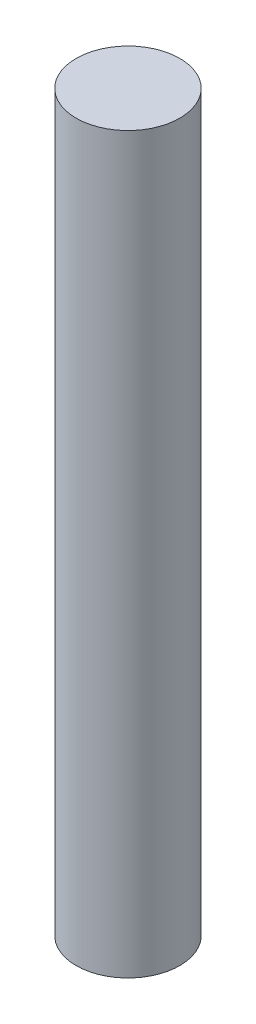
ISO-10303-21;
HEADER;
FILE_DESCRIPTION(('STEP AP214'),'2;1');
FILE_NAME('part.step','',(''),(''),'','','');
FILE_SCHEMA(('AUTOMOTIVE_DESIGN { 1 0 10303 214 1 1 1 1 }'));
ENDSEC;
DATA;
#1=APPLICATION_CONTEXT('core data for automotive mechanical design processes');
#2=APPLICATION_PROTOCOL_DEFINITION('international standard','automotive_design',2000,#1);
#3=PRODUCT_CONTEXT('',#1,'mechanical');
#4=PRODUCT('Part','Part','',(#3));
#5=PRODUCT_RELATED_PRODUCT_CATEGORY('part','',(#4));
#6=PRODUCT_DEFINITION_FORMATION('','',#4);
#7=PRODUCT_DEFINITION_CONTEXT('part definition',#1,'design');
#8=PRODUCT_DEFINITION('design','',#6,#7);
#9=PRODUCT_DEFINITION_SHAPE('','',#8);
#10=(LENGTH_UNIT() NAMED_UNIT(*) SI_UNIT(.MILLI.,.METRE.));
#11=(NAMED_UNIT(*) PLANE_ANGLE_UNIT() SI_UNIT($,.RADIAN.));
#12=(NAMED_UNIT(*) SI_UNIT($,.STERADIAN.) SOLID_ANGLE_UNIT());
#13=UNCERTAINTY_MEASURE_WITH_UNIT(LENGTH_MEASURE(1.E-05),#10,'distance_accuracy_value','');
#14=(GEOMETRIC_REPRESENTATION_CONTEXT(3) GLOBAL_UNCERTAINTY_ASSIGNED_CONTEXT((#13)) GLOBAL_UNIT_ASSIGNED_CONTEXT((#10,
#11,#12)) REPRESENTATION_CONTEXT('',''));
#15=CARTESIAN_POINT('',(0.,0.,0.));
#16=DIRECTION('',(0.,0.,1.));
#17=DIRECTION('',(1.,0.,0.));
#18=AXIS2_PLACEMENT_3D('',#15,#16,#17);
#19=CARTESIAN_POINT('',(0.,41.8,0.));
#20=DIRECTION('',(0.,-1.,0.));
#21=DIRECTION('',(0.,0.,-1.));
#22=AXIS2_PLACEMENT_3D('',#19,#20,#21);
#23=CYLINDRICAL_SURFACE('',#22,2.95);
#24=CARTESIAN_POINT('',(0.,41.8,0.));
#25=DIRECTION('',(0.,1.,0.));
#26=DIRECTION('',(0.,0.,1.));
#27=AXIS2_PLACEMENT_3D('',#24,#25,#26);
#28=CIRCLE('',#27,2.95);
#29=CARTESIAN_POINT('',(0.,41.8,2.95));
#30=VERTEX_POINT('',#29);
#31=EDGE_CURVE('E10',#30,#30,#28,.T.);
#32=ORIENTED_EDGE('',*,*,#31,.F.);
#33=EDGE_LOOP('',(#32));
#34=FACE_BOUND('',#33,.T.);
#35=CARTESIAN_POINT('',(0.,0.,0.));
#36=DIRECTION('',(0.,1.,0.));
#37=DIRECTION('',(0.,0.,1.));
#38=AXIS2_PLACEMENT_3D('',#35,#36,#37);
#39=CIRCLE('',#38,2.95);
#40=CARTESIAN_POINT('',(0.,0.,2.95));
#41=VERTEX_POINT('',#40);
#42=EDGE_CURVE('E44',#41,#41,#39,.T.);
#43=ORIENTED_EDGE('',*,*,#42,.T.);
#44=EDGE_LOOP('',(#43));
#45=FACE_BOUND('',#44,.T.);
#46=ADVANCED_FACE('F41',(#34,#45),#23,.T.);
#47=CARTESIAN_POINT('',(0.,41.8,0.));
#48=DIRECTION('',(0.,1.,0.));
#49=DIRECTION('',(0.,0.,1.));
#50=AXIS2_PLACEMENT_3D('',#47,#48,#49);
#51=PLANE('',#50);
#52=ORIENTED_EDGE('',*,*,#31,.T.);
#53=EDGE_LOOP('',(#52));
#54=FACE_BOUND('',#53,.T.);
#55=ADVANCED_FACE('F58',(#54),#51,.T.);
#56=CARTESIAN_POINT('',(0.,0.,0.));
#57=DIRECTION('',(0.,1.,0.));
#58=DIRECTION('',(0.,0.,1.));
#59=AXIS2_PLACEMENT_3D('',#56,#57,#58);
#60=PLANE('',#59);
#61=ORIENTED_EDGE('',*,*,#42,.F.);
#62=EDGE_LOOP('',(#61));
#63=FACE_BOUND('',#62,.T.);
#64=ADVANCED_FACE('F56',(#63),#60,.F.);
#65=CLOSED_SHELL('',(#46,#55,#64));
#66=MANIFOLD_SOLID_BREP('B2',#65);
#67=ADVANCED_BREP_SHAPE_REPRESENTATION('',(#18,#66),#14);
#68=SHAPE_DEFINITION_REPRESENTATION(#9,#67);
ENDSEC;
END-ISO-10303-21;
